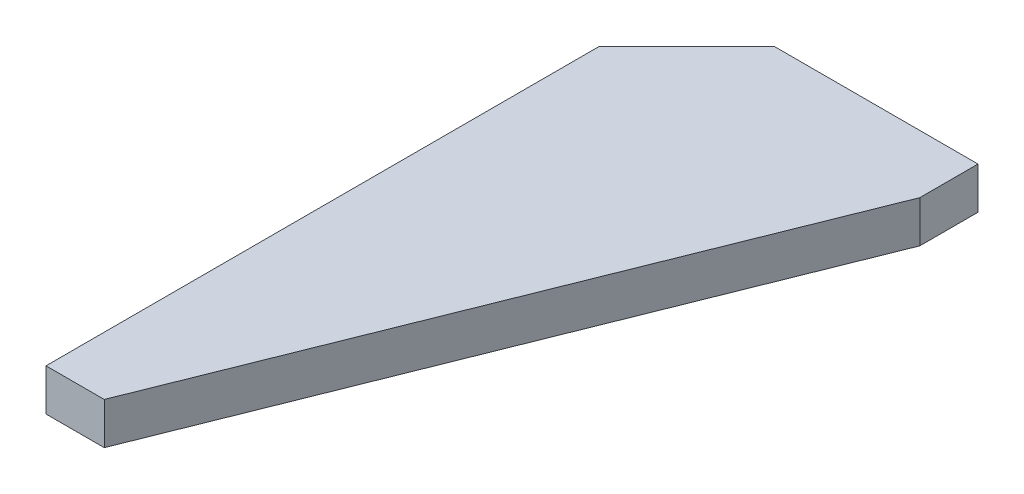
ISO-10303-21;
HEADER;
FILE_DESCRIPTION(('STEP AP214'),'2;1');
FILE_NAME('part.step','',(''),(''),'','','');
FILE_SCHEMA(('AUTOMOTIVE_DESIGN { 1 0 10303 214 1 1 1 1 }'));
ENDSEC;
DATA;
#1=APPLICATION_CONTEXT('core data for automotive mechanical design processes');
#2=APPLICATION_PROTOCOL_DEFINITION('international standard','automotive_design',2000,#1);
#3=PRODUCT_CONTEXT('',#1,'mechanical');
#4=PRODUCT('Part','Part','',(#3));
#5=PRODUCT_RELATED_PRODUCT_CATEGORY('part','',(#4));
#6=PRODUCT_DEFINITION_FORMATION('','',#4);
#7=PRODUCT_DEFINITION_CONTEXT('part definition',#1,'design');
#8=PRODUCT_DEFINITION('design','',#6,#7);
#9=PRODUCT_DEFINITION_SHAPE('','',#8);
#10=(LENGTH_UNIT() NAMED_UNIT(*) SI_UNIT(.MILLI.,.METRE.));
#11=(NAMED_UNIT(*) PLANE_ANGLE_UNIT() SI_UNIT($,.RADIAN.));
#12=(NAMED_UNIT(*) SI_UNIT($,.STERADIAN.) SOLID_ANGLE_UNIT());
#13=UNCERTAINTY_MEASURE_WITH_UNIT(LENGTH_MEASURE(1.E-05),#10,'distance_accuracy_value','');
#14=(GEOMETRIC_REPRESENTATION_CONTEXT(3) GLOBAL_UNCERTAINTY_ASSIGNED_CONTEXT((#13)) GLOBAL_UNIT_ASSIGNED_CONTEXT((#10,
#11,#12)) REPRESENTATION_CONTEXT('',''));
#15=CARTESIAN_POINT('',(0.,0.,0.));
#16=DIRECTION('',(0.,0.,1.));
#17=DIRECTION('',(1.,0.,0.));
#18=AXIS2_PLACEMENT_3D('',#15,#16,#17);
#19=CARTESIAN_POINT('',(0.,4.55422,0.));
#20=DIRECTION('',(0.,1.,0.));
#21=DIRECTION('',(0.,0.,1.));
#22=AXIS2_PLACEMENT_3D('',#19,#20,#21);
#23=PLANE('',#22);
#24=DIRECTION('',(-1.,0.,0.));
#25=VECTOR('',#24,1.);
#26=CARTESIAN_POINT('',(31.75,4.55422,0.));
#27=LINE('',#26,#25);
#28=CARTESIAN_POINT('',(9.525,4.55422,0.));
#29=VERTEX_POINT('',#28);
#30=CARTESIAN_POINT('',(31.75,4.55422,0.));
#31=VERTEX_POINT('',#30);
#32=EDGE_CURVE('E82',#29,#31,#27,.F.);
#33=ORIENTED_EDGE('',*,*,#32,.F.);
#34=DIRECTION('',(-0.707106781186548,0.,0.707106781186548));
#35=VECTOR('',#34,1.);
#36=CARTESIAN_POINT('',(9.525,4.55422,0.));
#37=LINE('',#36,#35);
#38=CARTESIAN_POINT('',(0.,4.55422,9.525));
#39=VERTEX_POINT('',#38);
#40=EDGE_CURVE('E20',#39,#29,#37,.F.);
#41=ORIENTED_EDGE('',*,*,#40,.F.);
#42=DIRECTION('',(0.,0.,1.));
#43=VECTOR('',#42,1.);
#44=CARTESIAN_POINT('',(0.,4.55422,9.525));
#45=LINE('',#44,#43);
#46=CARTESIAN_POINT('',(0.,4.55422,69.85));
#47=VERTEX_POINT('',#46);
#48=EDGE_CURVE('E71',#47,#39,#45,.F.);
#49=ORIENTED_EDGE('',*,*,#48,.F.);
#50=DIRECTION('',(1.,0.,0.));
#51=VECTOR('',#50,1.);
#52=CARTESIAN_POINT('',(0.,4.55422,69.85));
#53=LINE('',#52,#51);
#54=CARTESIAN_POINT('',(6.35,4.55422,69.85));
#55=VERTEX_POINT('',#54);
#56=EDGE_CURVE('E66',#55,#47,#53,.F.);
#57=ORIENTED_EDGE('',*,*,#56,.F.);
#58=DIRECTION('',(0.371390676354086,0.,-0.928476690885266));
#59=VECTOR('',#58,1.);
#60=CARTESIAN_POINT('',(6.35,4.55422,69.85));
#61=LINE('',#60,#59);
#62=CARTESIAN_POINT('',(31.7499999999999,4.55422,6.34999999999741));
#63=VERTEX_POINT('',#62);
#64=EDGE_CURVE('E93',#63,#55,#61,.F.);
#65=ORIENTED_EDGE('',*,*,#64,.F.);
#66=DIRECTION('',(0.,0.,-1.));
#67=VECTOR('',#66,1.);
#68=CARTESIAN_POINT('',(31.75,4.55422,6.35));
#69=LINE('',#68,#67);
#70=EDGE_CURVE('E97',#31,#63,#69,.F.);
#71=ORIENTED_EDGE('',*,*,#70,.F.);
#72=EDGE_LOOP('',(#33,#41,#49,#57,#65,#71));
#73=FACE_BOUND('',#72,.T.);
#74=ADVANCED_FACE('F17',(#73),#23,.T.);
#75=CARTESIAN_POINT('',(9.525,0.,0.));
#76=DIRECTION('',(-0.707106781186548,0.,-0.707106781186548));
#77=DIRECTION('',(-0.707106781186548,0.,0.707106781186548));
#78=AXIS2_PLACEMENT_3D('',#75,#76,#77);
#79=PLANE('',#78);
#80=DIRECTION('',(0.,1.,0.));
#81=VECTOR('',#80,1.);
#82=CARTESIAN_POINT('',(9.525,0.,0.));
#83=LINE('',#82,#81);
#84=CARTESIAN_POINT('',(9.525,0.,0.));
#85=VERTEX_POINT('',#84);
#86=EDGE_CURVE('E101',#85,#29,#83,.T.);
#87=ORIENTED_EDGE('',*,*,#86,.F.);
#88=DIRECTION('',(-0.707106781186548,0.,0.707106781186548));
#89=VECTOR('',#88,1.);
#90=CARTESIAN_POINT('',(9.525,0.,0.));
#91=LINE('',#90,#89);
#92=CARTESIAN_POINT('',(0.,0.,9.525));
#93=VERTEX_POINT('',#92);
#94=EDGE_CURVE('E88',#85,#93,#91,.T.);
#95=ORIENTED_EDGE('',*,*,#94,.T.);
#96=DIRECTION('',(0.,1.,0.));
#97=VECTOR('',#96,1.);
#98=CARTESIAN_POINT('',(0.,0.,9.525));
#99=LINE('',#98,#97);
#100=EDGE_CURVE('E76',#39,#93,#99,.F.);
#101=ORIENTED_EDGE('',*,*,#100,.F.);
#102=ORIENTED_EDGE('',*,*,#40,.T.);
#103=EDGE_LOOP('',(#87,#95,#101,#102));
#104=FACE_BOUND('',#103,.T.);
#105=ADVANCED_FACE('F87',(#104),#79,.T.);
#106=CARTESIAN_POINT('',(0.,0.,9.525));
#107=DIRECTION('',(-1.,0.,0.));
#108=DIRECTION('',(0.,0.,1.));
#109=AXIS2_PLACEMENT_3D('',#106,#107,#108);
#110=PLANE('',#109);
#111=ORIENTED_EDGE('',*,*,#100,.T.);
#112=DIRECTION('',(0.,0.,1.));
#113=VECTOR('',#112,1.);
#114=CARTESIAN_POINT('',(0.,0.,0.));
#115=LINE('',#114,#113);
#116=CARTESIAN_POINT('',(0.,0.,69.85));
#117=VERTEX_POINT('',#116);
#118=EDGE_CURVE('E106',#93,#117,#115,.T.);
#119=ORIENTED_EDGE('',*,*,#118,.T.);
#120=DIRECTION('',(0.,1.,0.));
#121=VECTOR('',#120,1.);
#122=CARTESIAN_POINT('',(0.,0.,69.85));
#123=LINE('',#122,#121);
#124=EDGE_CURVE('E78',#47,#117,#123,.F.);
#125=ORIENTED_EDGE('',*,*,#124,.F.);
#126=ORIENTED_EDGE('',*,*,#48,.T.);
#127=EDGE_LOOP('',(#111,#119,#125,#126));
#128=FACE_BOUND('',#127,.T.);
#129=ADVANCED_FACE('F73',(#128),#110,.T.);
#130=CARTESIAN_POINT('',(0.,0.,69.85));
#131=DIRECTION('',(0.,0.,1.));
#132=DIRECTION('',(1.,0.,0.));
#133=AXIS2_PLACEMENT_3D('',#130,#131,#132);
#134=PLANE('',#133);
#135=ORIENTED_EDGE('',*,*,#124,.T.);
#136=DIRECTION('',(1.,0.,0.));
#137=VECTOR('',#136,1.);
#138=CARTESIAN_POINT('',(0.,0.,69.85));
#139=LINE('',#138,#137);
#140=CARTESIAN_POINT('',(6.35,0.,69.85));
#141=VERTEX_POINT('',#140);
#142=EDGE_CURVE('E108',#117,#141,#139,.T.);
#143=ORIENTED_EDGE('',*,*,#142,.T.);
#144=DIRECTION('',(0.,1.,0.));
#145=VECTOR('',#144,1.);
#146=CARTESIAN_POINT('',(6.35,0.,69.85));
#147=LINE('',#146,#145);
#148=EDGE_CURVE('E95',#55,#141,#147,.F.);
#149=ORIENTED_EDGE('',*,*,#148,.F.);
#150=ORIENTED_EDGE('',*,*,#56,.T.);
#151=EDGE_LOOP('',(#135,#143,#149,#150));
#152=FACE_BOUND('',#151,.T.);
#153=ADVANCED_FACE('F126',(#152),#134,.T.);
#154=CARTESIAN_POINT('',(6.35,0.,69.85));
#155=DIRECTION('',(0.928476690885266,0.,0.371390676354086));
#156=DIRECTION('',(0.371390676354086,0.,-0.928476690885266));
#157=AXIS2_PLACEMENT_3D('',#154,#155,#156);
#158=PLANE('',#157);
#159=ORIENTED_EDGE('',*,*,#148,.T.);
#160=DIRECTION('',(0.371390676354091,0.,-0.928476690885264));
#161=VECTOR('',#160,1.);
#162=CARTESIAN_POINT('',(6.35,0.,69.85));
#163=LINE('',#162,#161);
#164=CARTESIAN_POINT('',(31.7499999999998,0.,6.34999999999738));
#165=VERTEX_POINT('',#164);
#166=EDGE_CURVE('E111',#141,#165,#163,.T.);
#167=ORIENTED_EDGE('',*,*,#166,.T.);
#168=DIRECTION('',(0.,1.,0.));
#169=VECTOR('',#168,1.);
#170=CARTESIAN_POINT('',(31.75,0.,6.34999999999746));
#171=LINE('',#170,#169);
#172=EDGE_CURVE('E99',#63,#165,#171,.F.);
#173=ORIENTED_EDGE('',*,*,#172,.F.);
#174=ORIENTED_EDGE('',*,*,#64,.T.);
#175=EDGE_LOOP('',(#159,#167,#173,#174));
#176=FACE_BOUND('',#175,.T.);
#177=ADVANCED_FACE('F124',(#176),#158,.T.);
#178=CARTESIAN_POINT('',(31.75,0.,6.35));
#179=DIRECTION('',(1.,0.,0.));
#180=DIRECTION('',(0.,0.,-1.));
#181=AXIS2_PLACEMENT_3D('',#178,#179,#180);
#182=PLANE('',#181);
#183=ORIENTED_EDGE('',*,*,#172,.T.);
#184=DIRECTION('',(0.,0.,1.));
#185=VECTOR('',#184,1.);
#186=CARTESIAN_POINT('',(31.75,0.,0.));
#187=LINE('',#186,#185);
#188=CARTESIAN_POINT('',(31.75,0.,0.));
#189=VERTEX_POINT('',#188);
#190=EDGE_CURVE('E26',#165,#189,#187,.F.);
#191=ORIENTED_EDGE('',*,*,#190,.T.);
#192=DIRECTION('',(0.,1.,0.));
#193=VECTOR('',#192,1.);
#194=CARTESIAN_POINT('',(31.75,0.,0.));
#195=LINE('',#194,#193);
#196=EDGE_CURVE('E34',#31,#189,#195,.F.);
#197=ORIENTED_EDGE('',*,*,#196,.F.);
#198=ORIENTED_EDGE('',*,*,#70,.T.);
#199=EDGE_LOOP('',(#183,#191,#197,#198));
#200=FACE_BOUND('',#199,.T.);
#201=ADVANCED_FACE('F117',(#200),#182,.T.);
#202=CARTESIAN_POINT('',(31.75,0.,0.));
#203=DIRECTION('',(0.,0.,-1.));
#204=DIRECTION('',(-1.,0.,0.));
#205=AXIS2_PLACEMENT_3D('',#202,#203,#204);
#206=PLANE('',#205);
#207=ORIENTED_EDGE('',*,*,#196,.T.);
#208=DIRECTION('',(1.,0.,0.));
#209=VECTOR('',#208,1.);
#210=CARTESIAN_POINT('',(0.,0.,0.));
#211=LINE('',#210,#209);
#212=EDGE_CURVE('E11',#189,#85,#211,.F.);
#213=ORIENTED_EDGE('',*,*,#212,.T.);
#214=ORIENTED_EDGE('',*,*,#86,.T.);
#215=ORIENTED_EDGE('',*,*,#32,.T.);
#216=EDGE_LOOP('',(#207,#213,#214,#215));
#217=FACE_BOUND('',#216,.T.);
#218=ADVANCED_FACE('F127',(#217),#206,.T.);
#219=CARTESIAN_POINT('',(0.,0.,0.));
#220=DIRECTION('',(0.,1.,0.));
#221=DIRECTION('',(0.,0.,1.));
#222=AXIS2_PLACEMENT_3D('',#219,#220,#221);
#223=PLANE('',#222);
#224=ORIENTED_EDGE('',*,*,#190,.F.);
#225=ORIENTED_EDGE('',*,*,#166,.F.);
#226=ORIENTED_EDGE('',*,*,#142,.F.);
#227=ORIENTED_EDGE('',*,*,#118,.F.);
#228=ORIENTED_EDGE('',*,*,#94,.F.);
#229=ORIENTED_EDGE('',*,*,#212,.F.);
#230=EDGE_LOOP('',(#224,#225,#226,#227,#228,#229));
#231=FACE_BOUND('',#230,.T.);
#232=ADVANCED_FACE('F121',(#231),#223,.F.);
#233=CLOSED_SHELL('',(#74,#105,#129,#153,#177,#201,#218,#232));
#234=MANIFOLD_SOLID_BREP('B1',#233);
#235=ADVANCED_BREP_SHAPE_REPRESENTATION('',(#18,#234),#14);
#236=SHAPE_DEFINITION_REPRESENTATION(#9,#235);
ENDSEC;
END-ISO-10303-21;
